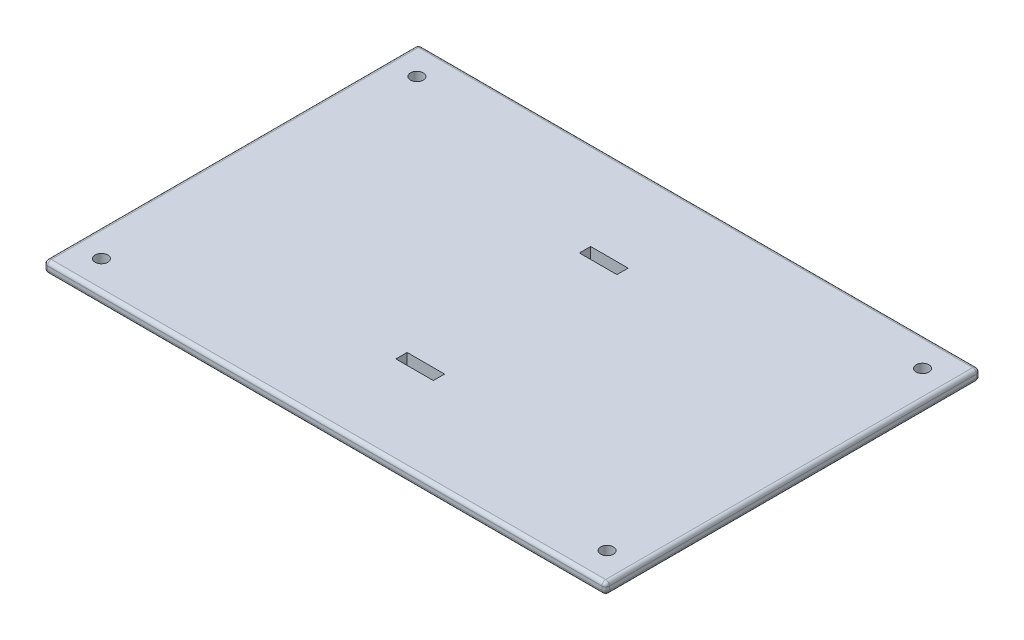
ISO-10303-21;
HEADER;
FILE_DESCRIPTION(('STEP AP214'),'2;1');
FILE_NAME('part.step','',(''),(''),'','','');
FILE_SCHEMA(('AUTOMOTIVE_DESIGN { 1 0 10303 214 1 1 1 1 }'));
ENDSEC;
DATA;
#1=APPLICATION_CONTEXT('core data for automotive mechanical design processes');
#2=APPLICATION_PROTOCOL_DEFINITION('international standard','automotive_design',2000,#1);
#3=PRODUCT_CONTEXT('',#1,'mechanical');
#4=PRODUCT('Part','Part','',(#3));
#5=PRODUCT_RELATED_PRODUCT_CATEGORY('part','',(#4));
#6=PRODUCT_DEFINITION_FORMATION('','',#4);
#7=PRODUCT_DEFINITION_CONTEXT('part definition',#1,'design');
#8=PRODUCT_DEFINITION('design','',#6,#7);
#9=PRODUCT_DEFINITION_SHAPE('','',#8);
#10=(LENGTH_UNIT() NAMED_UNIT(*) SI_UNIT(.MILLI.,.METRE.));
#11=(NAMED_UNIT(*) PLANE_ANGLE_UNIT() SI_UNIT($,.RADIAN.));
#12=(NAMED_UNIT(*) SI_UNIT($,.STERADIAN.) SOLID_ANGLE_UNIT());
#13=UNCERTAINTY_MEASURE_WITH_UNIT(LENGTH_MEASURE(1.E-05),#10,'distance_accuracy_value','');
#14=(GEOMETRIC_REPRESENTATION_CONTEXT(3) GLOBAL_UNCERTAINTY_ASSIGNED_CONTEXT((#13)) GLOBAL_UNIT_ASSIGNED_CONTEXT((#10,
#11,#12)) REPRESENTATION_CONTEXT('',''));
#15=CARTESIAN_POINT('',(0.,0.,0.));
#16=DIRECTION('',(0.,0.,1.));
#17=DIRECTION('',(1.,0.,0.));
#18=AXIS2_PLACEMENT_3D('',#15,#16,#17);
#19=CARTESIAN_POINT('',(75.,3.,50.));
#20=DIRECTION('',(-1.,0.,0.));
#21=DIRECTION('',(0.,0.,1.));
#22=AXIS2_PLACEMENT_3D('',#19,#20,#21);
#23=PLANE('',#22);
#24=DIRECTION('',(0.,-1.,0.));
#25=VECTOR('',#24,1.);
#26=CARTESIAN_POINT('',(75.,3.,49.));
#27=LINE('',#26,#25);
#28=CARTESIAN_POINT('',(75.,2.,49.));
#29=VERTEX_POINT('',#28);
#30=CARTESIAN_POINT('',(75.,1.,49.));
#31=VERTEX_POINT('',#30);
#32=EDGE_CURVE('E263',#29,#31,#27,.T.);
#33=ORIENTED_EDGE('',*,*,#32,.T.);
#34=DIRECTION('',(0.,0.,-1.));
#35=VECTOR('',#34,1.);
#36=CARTESIAN_POINT('',(75.,1.,-50.));
#37=LINE('',#36,#35);
#38=CARTESIAN_POINT('',(75.,1.,-49.));
#39=VERTEX_POINT('',#38);
#40=EDGE_CURVE('E266',#31,#39,#37,.T.);
#41=ORIENTED_EDGE('',*,*,#40,.T.);
#42=DIRECTION('',(0.,-1.,0.));
#43=VECTOR('',#42,1.);
#44=CARTESIAN_POINT('',(75.,3.,-49.));
#45=LINE('',#44,#43);
#46=CARTESIAN_POINT('',(75.,2.,-49.));
#47=VERTEX_POINT('',#46);
#48=EDGE_CURVE('E260',#39,#47,#45,.F.);
#49=ORIENTED_EDGE('',*,*,#48,.T.);
#50=DIRECTION('',(0.,0.,-1.));
#51=VECTOR('',#50,1.);
#52=CARTESIAN_POINT('',(75.,2.,50.));
#53=LINE('',#52,#51);
#54=EDGE_CURVE('E258',#47,#29,#53,.F.);
#55=ORIENTED_EDGE('',*,*,#54,.T.);
#56=EDGE_LOOP('',(#33,#41,#49,#55));
#57=FACE_BOUND('',#56,.T.);
#58=ADVANCED_FACE('F32',(#57),#23,.F.);
#59=CARTESIAN_POINT('',(-75.,3.,-50.));
#60=DIRECTION('',(0.,0.,1.));
#61=DIRECTION('',(1.,0.,0.));
#62=AXIS2_PLACEMENT_3D('',#59,#60,#61);
#63=PLANE('',#62);
#64=DIRECTION('',(0.,-1.,0.));
#65=VECTOR('',#64,1.);
#66=CARTESIAN_POINT('',(74.,3.,-50.));
#67=LINE('',#66,#65);
#68=CARTESIAN_POINT('',(74.,2.,-50.));
#69=VERTEX_POINT('',#68);
#70=CARTESIAN_POINT('',(74.,1.,-50.));
#71=VERTEX_POINT('',#70);
#72=EDGE_CURVE('E281',#69,#71,#67,.T.);
#73=ORIENTED_EDGE('',*,*,#72,.T.);
#74=DIRECTION('',(-1.,0.,0.));
#75=VECTOR('',#74,1.);
#76=CARTESIAN_POINT('',(-75.,1.,-50.));
#77=LINE('',#76,#75);
#78=CARTESIAN_POINT('',(-74.,1.,-50.));
#79=VERTEX_POINT('',#78);
#80=EDGE_CURVE('E284',#71,#79,#77,.T.);
#81=ORIENTED_EDGE('',*,*,#80,.T.);
#82=DIRECTION('',(0.,-1.,0.));
#83=VECTOR('',#82,1.);
#84=CARTESIAN_POINT('',(-74.,3.,-50.));
#85=LINE('',#84,#83);
#86=CARTESIAN_POINT('',(-74.,2.,-50.));
#87=VERTEX_POINT('',#86);
#88=EDGE_CURVE('E279',#79,#87,#85,.F.);
#89=ORIENTED_EDGE('',*,*,#88,.T.);
#90=DIRECTION('',(-1.,0.,0.));
#91=VECTOR('',#90,1.);
#92=CARTESIAN_POINT('',(-75.,2.,-50.));
#93=LINE('',#92,#91);
#94=EDGE_CURVE('E277',#87,#69,#93,.F.);
#95=ORIENTED_EDGE('',*,*,#94,.T.);
#96=EDGE_LOOP('',(#73,#81,#89,#95));
#97=FACE_BOUND('',#96,.T.);
#98=ADVANCED_FACE('F451',(#97),#63,.F.);
#99=CARTESIAN_POINT('',(-75.,3.,50.));
#100=DIRECTION('',(1.,0.,0.));
#101=DIRECTION('',(0.,0.,-1.));
#102=AXIS2_PLACEMENT_3D('',#99,#100,#101);
#103=PLANE('',#102);
#104=DIRECTION('',(0.,-1.,0.));
#105=VECTOR('',#104,1.);
#106=CARTESIAN_POINT('',(-75.,3.,-49.));
#107=LINE('',#106,#105);
#108=CARTESIAN_POINT('',(-75.,2.,-49.));
#109=VERTEX_POINT('',#108);
#110=CARTESIAN_POINT('',(-75.,1.,-49.));
#111=VERTEX_POINT('',#110);
#112=EDGE_CURVE('E290',#109,#111,#107,.T.);
#113=ORIENTED_EDGE('',*,*,#112,.T.);
#114=DIRECTION('',(0.,0.,1.));
#115=VECTOR('',#114,1.);
#116=CARTESIAN_POINT('',(-75.,1.,50.));
#117=LINE('',#116,#115);
#118=CARTESIAN_POINT('',(-75.,1.,49.));
#119=VERTEX_POINT('',#118);
#120=EDGE_CURVE('E293',#111,#119,#117,.T.);
#121=ORIENTED_EDGE('',*,*,#120,.T.);
#122=DIRECTION('',(0.,-1.,0.));
#123=VECTOR('',#122,1.);
#124=CARTESIAN_POINT('',(-75.,3.,49.));
#125=LINE('',#124,#123);
#126=CARTESIAN_POINT('',(-75.,2.,49.));
#127=VERTEX_POINT('',#126);
#128=EDGE_CURVE('E288',#119,#127,#125,.F.);
#129=ORIENTED_EDGE('',*,*,#128,.T.);
#130=DIRECTION('',(0.,0.,1.));
#131=VECTOR('',#130,1.);
#132=CARTESIAN_POINT('',(-75.,2.,50.));
#133=LINE('',#132,#131);
#134=EDGE_CURVE('E286',#127,#109,#133,.F.);
#135=ORIENTED_EDGE('',*,*,#134,.T.);
#136=EDGE_LOOP('',(#113,#121,#129,#135));
#137=FACE_BOUND('',#136,.T.);
#138=ADVANCED_FACE('F435',(#137),#103,.F.);
#139=CARTESIAN_POINT('',(-75.,3.,50.));
#140=DIRECTION('',(0.,0.,-1.));
#141=DIRECTION('',(-1.,0.,0.));
#142=AXIS2_PLACEMENT_3D('',#139,#140,#141);
#143=PLANE('',#142);
#144=DIRECTION('',(0.,-1.,0.));
#145=VECTOR('',#144,1.);
#146=CARTESIAN_POINT('',(-74.,3.,50.));
#147=LINE('',#146,#145);
#148=CARTESIAN_POINT('',(-74.,2.,50.));
#149=VERTEX_POINT('',#148);
#150=CARTESIAN_POINT('',(-74.,1.,50.));
#151=VERTEX_POINT('',#150);
#152=EDGE_CURVE('E270',#149,#151,#147,.T.);
#153=ORIENTED_EDGE('',*,*,#152,.T.);
#154=DIRECTION('',(1.,0.,0.));
#155=VECTOR('',#154,1.);
#156=CARTESIAN_POINT('',(75.,1.,50.));
#157=LINE('',#156,#155);
#158=CARTESIAN_POINT('',(74.,1.,50.));
#159=VERTEX_POINT('',#158);
#160=EDGE_CURVE('E275',#151,#159,#157,.T.);
#161=ORIENTED_EDGE('',*,*,#160,.T.);
#162=DIRECTION('',(0.,-1.,0.));
#163=VECTOR('',#162,1.);
#164=CARTESIAN_POINT('',(74.,3.,50.));
#165=LINE('',#164,#163);
#166=CARTESIAN_POINT('',(74.,2.,50.));
#167=VERTEX_POINT('',#166);
#168=EDGE_CURVE('E272',#159,#167,#165,.F.);
#169=ORIENTED_EDGE('',*,*,#168,.T.);
#170=DIRECTION('',(1.,0.,0.));
#171=VECTOR('',#170,1.);
#172=CARTESIAN_POINT('',(-75.,2.,50.));
#173=LINE('',#172,#171);
#174=EDGE_CURVE('E268',#167,#149,#173,.F.);
#175=ORIENTED_EDGE('',*,*,#174,.T.);
#176=EDGE_LOOP('',(#153,#161,#169,#175));
#177=FACE_BOUND('',#176,.T.);
#178=ADVANCED_FACE('F487',(#177),#143,.F.);
#179=CARTESIAN_POINT('',(75.,3.,-50.));
#180=DIRECTION('',(0.,-1.,0.));
#181=DIRECTION('',(0.,0.,-1.));
#182=AXIS2_PLACEMENT_3D('',#179,#180,#181);
#183=PLANE('',#182);
#184=DIRECTION('',(-1.,0.,0.));
#185=VECTOR('',#184,1.);
#186=CARTESIAN_POINT('',(-5.,3.,23.));
#187=LINE('',#186,#185);
#188=CARTESIAN_POINT('',(4.99999999999999,3.,23.));
#189=VERTEX_POINT('',#188);
#190=CARTESIAN_POINT('',(-5.,3.,23.));
#191=VERTEX_POINT('',#190);
#192=EDGE_CURVE('E198',#189,#191,#187,.T.);
#193=ORIENTED_EDGE('',*,*,#192,.F.);
#194=DIRECTION('',(0.,0.,-1.));
#195=VECTOR('',#194,1.);
#196=CARTESIAN_POINT('',(5.,3.,26.));
#197=LINE('',#196,#195);
#198=CARTESIAN_POINT('',(5.,3.,26.));
#199=VERTEX_POINT('',#198);
#200=EDGE_CURVE('E49',#199,#189,#197,.T.);
#201=ORIENTED_EDGE('',*,*,#200,.F.);
#202=DIRECTION('',(1.,0.,0.));
#203=VECTOR('',#202,1.);
#204=CARTESIAN_POINT('',(-5.,3.,26.));
#205=LINE('',#204,#203);
#206=CARTESIAN_POINT('',(-5.,3.,26.));
#207=VERTEX_POINT('',#206);
#208=EDGE_CURVE('E189',#207,#199,#205,.T.);
#209=ORIENTED_EDGE('',*,*,#208,.F.);
#210=DIRECTION('',(0.,0.,1.));
#211=VECTOR('',#210,1.);
#212=CARTESIAN_POINT('',(-5.,3.,26.));
#213=LINE('',#212,#211);
#214=EDGE_CURVE('E192',#191,#207,#213,.T.);
#215=ORIENTED_EDGE('',*,*,#214,.F.);
#216=EDGE_LOOP('',(#193,#201,#209,#215));
#217=FACE_BOUND('',#216,.T.);
#218=DIRECTION('',(-1.,0.,0.));
#219=VECTOR('',#218,1.);
#220=CARTESIAN_POINT('',(-5.00000000000001,3.,-26.));
#221=LINE('',#220,#219);
#222=CARTESIAN_POINT('',(4.99999999999999,3.,-26.));
#223=VERTEX_POINT('',#222);
#224=CARTESIAN_POINT('',(-5.00000000000001,3.,-26.));
#225=VERTEX_POINT('',#224);
#226=EDGE_CURVE('E223',#223,#225,#221,.T.);
#227=ORIENTED_EDGE('',*,*,#226,.F.);
#228=DIRECTION('',(0.,0.,-1.));
#229=VECTOR('',#228,1.);
#230=CARTESIAN_POINT('',(4.99999999999999,3.,-26.));
#231=LINE('',#230,#229);
#232=CARTESIAN_POINT('',(5.,3.,-23.));
#233=VERTEX_POINT('',#232);
#234=EDGE_CURVE('E204',#233,#223,#231,.T.);
#235=ORIENTED_EDGE('',*,*,#234,.F.);
#236=DIRECTION('',(1.,0.,0.));
#237=VECTOR('',#236,1.);
#238=CARTESIAN_POINT('',(-5.,3.,-23.));
#239=LINE('',#238,#237);
#240=CARTESIAN_POINT('',(-5.,3.,-23.));
#241=VERTEX_POINT('',#240);
#242=EDGE_CURVE('E212',#241,#233,#239,.T.);
#243=ORIENTED_EDGE('',*,*,#242,.F.);
#244=DIRECTION('',(0.,0.,1.));
#245=VECTOR('',#244,1.);
#246=CARTESIAN_POINT('',(-5.00000000000001,3.,-26.));
#247=LINE('',#246,#245);
#248=EDGE_CURVE('E226',#225,#241,#247,.T.);
#249=ORIENTED_EDGE('',*,*,#248,.F.);
#250=EDGE_LOOP('',(#227,#235,#243,#249));
#251=FACE_BOUND('',#250,.T.);
#252=CARTESIAN_POINT('',(-67.5000000000001,3.,42.113248654052));
#253=DIRECTION('',(0.,1.,0.));
#254=DIRECTION('',(0.,0.,1.));
#255=AXIS2_PLACEMENT_3D('',#252,#253,#254);
#256=CIRCLE('',#255,1.69999999999999);
#257=CARTESIAN_POINT('',(-67.5000000000001,3.,43.813248654052));
#258=VERTEX_POINT('',#257);
#259=EDGE_CURVE('E233',#258,#258,#256,.T.);
#260=ORIENTED_EDGE('',*,*,#259,.F.);
#261=EDGE_LOOP('',(#260));
#262=FACE_BOUND('',#261,.T.);
#263=CARTESIAN_POINT('',(67.4999999999999,3.,42.1132486540518));
#264=DIRECTION('',(0.,1.,0.));
#265=DIRECTION('',(0.,0.,1.));
#266=AXIS2_PLACEMENT_3D('',#263,#264,#265);
#267=CIRCLE('',#266,1.69999999999999);
#268=CARTESIAN_POINT('',(67.4999999999999,3.,43.8132486540518));
#269=VERTEX_POINT('',#268);
#270=EDGE_CURVE('E242',#269,#269,#267,.T.);
#271=ORIENTED_EDGE('',*,*,#270,.F.);
#272=EDGE_LOOP('',(#271));
#273=FACE_BOUND('',#272,.T.);
#274=CARTESIAN_POINT('',(67.5000000000003,3.,-42.1132486540519));
#275=DIRECTION('',(0.,1.,0.));
#276=DIRECTION('',(0.,0.,1.));
#277=AXIS2_PLACEMENT_3D('',#274,#275,#276);
#278=CIRCLE('',#277,1.69999999999999);
#279=CARTESIAN_POINT('',(67.5000000000003,3.,-40.4132486540519));
#280=VERTEX_POINT('',#279);
#281=EDGE_CURVE('E248',#280,#280,#278,.T.);
#282=ORIENTED_EDGE('',*,*,#281,.F.);
#283=EDGE_LOOP('',(#282));
#284=FACE_BOUND('',#283,.T.);
#285=CARTESIAN_POINT('',(-67.5000000000001,3.,-42.1132486540518));
#286=DIRECTION('',(0.,1.,0.));
#287=DIRECTION('',(0.,0.,1.));
#288=AXIS2_PLACEMENT_3D('',#285,#286,#287);
#289=CIRCLE('',#288,1.69999999999999);
#290=CARTESIAN_POINT('',(-67.5000000000001,3.,-40.4132486540518));
#291=VERTEX_POINT('',#290);
#292=EDGE_CURVE('E254',#291,#291,#289,.T.);
#293=ORIENTED_EDGE('',*,*,#292,.F.);
#294=EDGE_LOOP('',(#293));
#295=FACE_BOUND('',#294,.T.);
#296=DIRECTION('',(0.,0.,1.));
#297=VECTOR('',#296,1.);
#298=CARTESIAN_POINT('',(-74.,3.,-50.));
#299=LINE('',#298,#297);
#300=CARTESIAN_POINT('',(-74.,3.,-49.));
#301=VERTEX_POINT('',#300);
#302=CARTESIAN_POINT('',(-74.,3.,49.));
#303=VERTEX_POINT('',#302);
#304=EDGE_CURVE('E41',#301,#303,#299,.T.);
#305=ORIENTED_EDGE('',*,*,#304,.T.);
#306=DIRECTION('',(1.,0.,0.));
#307=VECTOR('',#306,1.);
#308=CARTESIAN_POINT('',(75.,3.,49.));
#309=LINE('',#308,#307);
#310=CARTESIAN_POINT('',(74.,3.,49.));
#311=VERTEX_POINT('',#310);
#312=EDGE_CURVE('E11',#303,#311,#309,.T.);
#313=ORIENTED_EDGE('',*,*,#312,.T.);
#314=DIRECTION('',(0.,0.,-1.));
#315=VECTOR('',#314,1.);
#316=CARTESIAN_POINT('',(74.,3.,-50.));
#317=LINE('',#316,#315);
#318=CARTESIAN_POINT('',(74.,3.,-49.));
#319=VERTEX_POINT('',#318);
#320=EDGE_CURVE('E304',#311,#319,#317,.T.);
#321=ORIENTED_EDGE('',*,*,#320,.T.);
#322=DIRECTION('',(-1.,0.,0.));
#323=VECTOR('',#322,1.);
#324=CARTESIAN_POINT('',(75.,3.,-49.));
#325=LINE('',#324,#323);
#326=EDGE_CURVE('E306',#319,#301,#325,.T.);
#327=ORIENTED_EDGE('',*,*,#326,.T.);
#328=EDGE_LOOP('',(#305,#313,#321,#327));
#329=FACE_BOUND('',#328,.T.);
#330=ADVANCED_FACE('F383',(#217,#251,#262,#273,#284,#295,#329),#183,.F.);
#331=CARTESIAN_POINT('',(75.,0.,-50.));
#332=DIRECTION('',(0.,-1.,0.));
#333=DIRECTION('',(0.,0.,-1.));
#334=AXIS2_PLACEMENT_3D('',#331,#332,#333);
#335=PLANE('',#334);
#336=DIRECTION('',(0.,0.,-1.));
#337=VECTOR('',#336,1.);
#338=CARTESIAN_POINT('',(5.,0.,26.));
#339=LINE('',#338,#337);
#340=CARTESIAN_POINT('',(5.,0.,26.));
#341=VERTEX_POINT('',#340);
#342=CARTESIAN_POINT('',(5.,0.,23.));
#343=VERTEX_POINT('',#342);
#344=EDGE_CURVE('E173',#341,#343,#339,.T.);
#345=ORIENTED_EDGE('',*,*,#344,.T.);
#346=DIRECTION('',(-1.,0.,0.));
#347=VECTOR('',#346,1.);
#348=CARTESIAN_POINT('',(-5.,0.,23.));
#349=LINE('',#348,#347);
#350=CARTESIAN_POINT('',(-5.,0.,23.));
#351=VERTEX_POINT('',#350);
#352=EDGE_CURVE('E182',#343,#351,#349,.T.);
#353=ORIENTED_EDGE('',*,*,#352,.T.);
#354=DIRECTION('',(0.,0.,1.));
#355=VECTOR('',#354,1.);
#356=CARTESIAN_POINT('',(-5.,0.,26.));
#357=LINE('',#356,#355);
#358=CARTESIAN_POINT('',(-5.,0.,26.));
#359=VERTEX_POINT('',#358);
#360=EDGE_CURVE('E57',#351,#359,#357,.T.);
#361=ORIENTED_EDGE('',*,*,#360,.T.);
#362=DIRECTION('',(1.,0.,0.));
#363=VECTOR('',#362,1.);
#364=CARTESIAN_POINT('',(-5.,0.,26.));
#365=LINE('',#364,#363);
#366=EDGE_CURVE('E179',#359,#341,#365,.T.);
#367=ORIENTED_EDGE('',*,*,#366,.T.);
#368=EDGE_LOOP('',(#345,#353,#361,#367));
#369=FACE_BOUND('',#368,.T.);
#370=DIRECTION('',(0.,0.,-1.));
#371=VECTOR('',#370,1.);
#372=CARTESIAN_POINT('',(4.99999999999999,0.,-26.));
#373=LINE('',#372,#371);
#374=CARTESIAN_POINT('',(5.,0.,-23.));
#375=VERTEX_POINT('',#374);
#376=CARTESIAN_POINT('',(4.99999999999999,0.,-26.));
#377=VERTEX_POINT('',#376);
#378=EDGE_CURVE('E208',#375,#377,#373,.T.);
#379=ORIENTED_EDGE('',*,*,#378,.T.);
#380=DIRECTION('',(-1.,0.,0.));
#381=VECTOR('',#380,1.);
#382=CARTESIAN_POINT('',(-5.00000000000001,0.,-26.));
#383=LINE('',#382,#381);
#384=CARTESIAN_POINT('',(-5.,0.,-26.));
#385=VERTEX_POINT('',#384);
#386=EDGE_CURVE('E211',#377,#385,#383,.T.);
#387=ORIENTED_EDGE('',*,*,#386,.T.);
#388=DIRECTION('',(0.,0.,1.));
#389=VECTOR('',#388,1.);
#390=CARTESIAN_POINT('',(-5.00000000000001,0.,-26.));
#391=LINE('',#390,#389);
#392=CARTESIAN_POINT('',(-5.,0.,-23.));
#393=VERTEX_POINT('',#392);
#394=EDGE_CURVE('E215',#385,#393,#391,.T.);
#395=ORIENTED_EDGE('',*,*,#394,.T.);
#396=DIRECTION('',(1.,0.,0.));
#397=VECTOR('',#396,1.);
#398=CARTESIAN_POINT('',(-5.,0.,-23.));
#399=LINE('',#398,#397);
#400=EDGE_CURVE('E218',#393,#375,#399,.T.);
#401=ORIENTED_EDGE('',*,*,#400,.T.);
#402=EDGE_LOOP('',(#379,#387,#395,#401));
#403=FACE_BOUND('',#402,.T.);
#404=CARTESIAN_POINT('',(-67.5000000000001,0.,42.113248654052));
#405=DIRECTION('',(0.,-1.,0.));
#406=DIRECTION('',(0.,0.,-1.));
#407=AXIS2_PLACEMENT_3D('',#404,#405,#406);
#408=CIRCLE('',#407,1.69999999999999);
#409=CARTESIAN_POINT('',(-67.5000000000001,0.,40.413248654052));
#410=VERTEX_POINT('',#409);
#411=EDGE_CURVE('E36',#410,#410,#408,.T.);
#412=ORIENTED_EDGE('',*,*,#411,.F.);
#413=EDGE_LOOP('',(#412));
#414=FACE_BOUND('',#413,.T.);
#415=CARTESIAN_POINT('',(67.4999999999999,0.,42.1132486540518));
#416=DIRECTION('',(0.,-1.,0.));
#417=DIRECTION('',(0.,0.,-1.));
#418=AXIS2_PLACEMENT_3D('',#415,#416,#417);
#419=CIRCLE('',#418,1.69999999999999);
#420=CARTESIAN_POINT('',(67.4999999999999,0.,40.4132486540518));
#421=VERTEX_POINT('',#420);
#422=EDGE_CURVE('E245',#421,#421,#419,.T.);
#423=ORIENTED_EDGE('',*,*,#422,.F.);
#424=EDGE_LOOP('',(#423));
#425=FACE_BOUND('',#424,.T.);
#426=CARTESIAN_POINT('',(67.5000000000003,0.,-42.1132486540519));
#427=DIRECTION('',(0.,-1.,0.));
#428=DIRECTION('',(0.,0.,-1.));
#429=AXIS2_PLACEMENT_3D('',#426,#427,#428);
#430=CIRCLE('',#429,1.69999999999999);
#431=CARTESIAN_POINT('',(67.5000000000003,0.,-43.8132486540519));
#432=VERTEX_POINT('',#431);
#433=EDGE_CURVE('E251',#432,#432,#430,.T.);
#434=ORIENTED_EDGE('',*,*,#433,.F.);
#435=EDGE_LOOP('',(#434));
#436=FACE_BOUND('',#435,.T.);
#437=CARTESIAN_POINT('',(-67.5000000000001,0.,-42.1132486540518));
#438=DIRECTION('',(0.,-1.,0.));
#439=DIRECTION('',(0.,0.,-1.));
#440=AXIS2_PLACEMENT_3D('',#437,#438,#439);
#441=CIRCLE('',#440,1.69999999999999);
#442=CARTESIAN_POINT('',(-67.5000000000001,0.,-43.8132486540518));
#443=VERTEX_POINT('',#442);
#444=EDGE_CURVE('E257',#443,#443,#441,.T.);
#445=ORIENTED_EDGE('',*,*,#444,.F.);
#446=EDGE_LOOP('',(#445));
#447=FACE_BOUND('',#446,.T.);
#448=DIRECTION('',(0.,0.,1.));
#449=VECTOR('',#448,1.);
#450=CARTESIAN_POINT('',(-74.,0.,-50.));
#451=LINE('',#450,#449);
#452=CARTESIAN_POINT('',(-74.,0.,49.));
#453=VERTEX_POINT('',#452);
#454=CARTESIAN_POINT('',(-74.,0.,-49.));
#455=VERTEX_POINT('',#454);
#456=EDGE_CURVE('E299',#453,#455,#451,.F.);
#457=ORIENTED_EDGE('',*,*,#456,.T.);
#458=DIRECTION('',(-1.,0.,0.));
#459=VECTOR('',#458,1.);
#460=CARTESIAN_POINT('',(75.,0.,-49.));
#461=LINE('',#460,#459);
#462=CARTESIAN_POINT('',(74.,0.,-49.));
#463=VERTEX_POINT('',#462);
#464=EDGE_CURVE('E301',#455,#463,#461,.F.);
#465=ORIENTED_EDGE('',*,*,#464,.T.);
#466=DIRECTION('',(0.,0.,-1.));
#467=VECTOR('',#466,1.);
#468=CARTESIAN_POINT('',(74.,0.,50.));
#469=LINE('',#468,#467);
#470=CARTESIAN_POINT('',(74.,0.,49.));
#471=VERTEX_POINT('',#470);
#472=EDGE_CURVE('E295',#463,#471,#469,.F.);
#473=ORIENTED_EDGE('',*,*,#472,.T.);
#474=DIRECTION('',(1.,0.,0.));
#475=VECTOR('',#474,1.);
#476=CARTESIAN_POINT('',(-75.,0.,49.));
#477=LINE('',#476,#475);
#478=EDGE_CURVE('E297',#471,#453,#477,.F.);
#479=ORIENTED_EDGE('',*,*,#478,.T.);
#480=EDGE_LOOP('',(#457,#465,#473,#479));
#481=FACE_BOUND('',#480,.T.);
#482=ADVANCED_FACE('F186',(#369,#403,#414,#425,#436,#447,#481),#335,.T.);
#483=CARTESIAN_POINT('',(-74.,3.,-49.));
#484=DIRECTION('',(0.,-1.,0.));
#485=DIRECTION('',(0.,0.,-1.));
#486=AXIS2_PLACEMENT_3D('',#483,#484,#485);
#487=CYLINDRICAL_SURFACE('',#486,1.);
#488=CARTESIAN_POINT('',(-74.,2.,-49.));
#489=DIRECTION('',(0.,1.,0.));
#490=DIRECTION('',(0.,0.,1.));
#491=AXIS2_PLACEMENT_3D('',#488,#489,#490);
#492=CIRCLE('',#491,1.);
#493=EDGE_CURVE('E261',#87,#109,#492,.T.);
#494=ORIENTED_EDGE('',*,*,#493,.F.);
#495=ORIENTED_EDGE('',*,*,#88,.F.);
#496=CARTESIAN_POINT('',(-74.,1.,-49.));
#497=DIRECTION('',(0.,-1.,0.));
#498=DIRECTION('',(0.,0.,-1.));
#499=AXIS2_PLACEMENT_3D('',#496,#497,#498);
#500=CIRCLE('',#499,1.);
#501=EDGE_CURVE('E371',#111,#79,#500,.T.);
#502=ORIENTED_EDGE('',*,*,#501,.F.);
#503=ORIENTED_EDGE('',*,*,#112,.F.);
#504=EDGE_LOOP('',(#494,#495,#502,#503));
#505=FACE_BOUND('',#504,.T.);
#506=ADVANCED_FACE('F34',(#505),#487,.T.);
#507=CARTESIAN_POINT('',(-74.,2.,-49.));
#508=DIRECTION('',(0.,0.,1.));
#509=DIRECTION('',(1.,0.,0.));
#510=AXIS2_PLACEMENT_3D('',#507,#508,#509);
#511=SPHERICAL_SURFACE('',#510,1.);
#512=CARTESIAN_POINT('',(-74.,2.,-49.));
#513=DIRECTION('',(-1.,0.,0.));
#514=DIRECTION('',(0.,0.,1.));
#515=AXIS2_PLACEMENT_3D('',#512,#513,#514);
#516=CIRCLE('',#515,1.);
#517=EDGE_CURVE('E365',#87,#301,#516,.F.);
#518=ORIENTED_EDGE('',*,*,#517,.F.);
#519=ORIENTED_EDGE('',*,*,#493,.T.);
#520=CARTESIAN_POINT('',(-74.,2.,-49.));
#521=DIRECTION('',(0.,0.,-1.));
#522=DIRECTION('',(-1.,0.,0.));
#523=AXIS2_PLACEMENT_3D('',#520,#521,#522);
#524=CIRCLE('',#523,1.);
#525=EDGE_CURVE('E368',#301,#109,#524,.F.);
#526=ORIENTED_EDGE('',*,*,#525,.F.);
#527=EDGE_LOOP('',(#518,#519,#526));
#528=FACE_BOUND('',#527,.T.);
#529=ADVANCED_FACE('F445',(#528),#511,.T.);
#530=CARTESIAN_POINT('',(-74.,1.,-49.));
#531=DIRECTION('',(0.,0.,1.));
#532=DIRECTION('',(1.,0.,0.));
#533=AXIS2_PLACEMENT_3D('',#530,#531,#532);
#534=SPHERICAL_SURFACE('',#533,1.);
#535=CARTESIAN_POINT('',(-74.,1.,-49.));
#536=DIRECTION('',(0.,0.,-1.));
#537=DIRECTION('',(-1.,0.,0.));
#538=AXIS2_PLACEMENT_3D('',#535,#536,#537);
#539=CIRCLE('',#538,1.);
#540=EDGE_CURVE('E359',#111,#455,#539,.F.);
#541=ORIENTED_EDGE('',*,*,#540,.F.);
#542=ORIENTED_EDGE('',*,*,#501,.T.);
#543=CARTESIAN_POINT('',(-74.,1.,-49.));
#544=DIRECTION('',(-1.,0.,0.));
#545=DIRECTION('',(0.,0.,1.));
#546=AXIS2_PLACEMENT_3D('',#543,#544,#545);
#547=CIRCLE('',#546,1.);
#548=EDGE_CURVE('E362',#455,#79,#547,.F.);
#549=ORIENTED_EDGE('',*,*,#548,.F.);
#550=EDGE_LOOP('',(#541,#542,#549));
#551=FACE_BOUND('',#550,.T.);
#552=ADVANCED_FACE('F395',(#551),#534,.T.);
#553=CARTESIAN_POINT('',(-74.,2.,-50.));
#554=DIRECTION('',(0.,0.,1.));
#555=DIRECTION('',(1.,0.,0.));
#556=AXIS2_PLACEMENT_3D('',#553,#554,#555);
#557=CYLINDRICAL_SURFACE('',#556,1.);
#558=ORIENTED_EDGE('',*,*,#525,.T.);
#559=ORIENTED_EDGE('',*,*,#134,.F.);
#560=CARTESIAN_POINT('',(-74.,2.,49.));
#561=DIRECTION('',(0.,0.,1.));
#562=DIRECTION('',(1.,0.,0.));
#563=AXIS2_PLACEMENT_3D('',#560,#561,#562);
#564=CIRCLE('',#563,1.);
#565=EDGE_CURVE('E353',#303,#127,#564,.T.);
#566=ORIENTED_EDGE('',*,*,#565,.F.);
#567=ORIENTED_EDGE('',*,*,#304,.F.);
#568=EDGE_LOOP('',(#558,#559,#566,#567));
#569=FACE_BOUND('',#568,.T.);
#570=ADVANCED_FACE('F439',(#569),#557,.T.);
#571=CARTESIAN_POINT('',(75.,2.,-49.));
#572=DIRECTION('',(-1.,0.,0.));
#573=DIRECTION('',(0.,0.,1.));
#574=AXIS2_PLACEMENT_3D('',#571,#572,#573);
#575=CYLINDRICAL_SURFACE('',#574,1.);
#576=ORIENTED_EDGE('',*,*,#517,.T.);
#577=ORIENTED_EDGE('',*,*,#326,.F.);
#578=CARTESIAN_POINT('',(74.,2.,-49.));
#579=DIRECTION('',(1.,0.,0.));
#580=DIRECTION('',(0.,0.,-1.));
#581=AXIS2_PLACEMENT_3D('',#578,#579,#580);
#582=CIRCLE('',#581,1.);
#583=EDGE_CURVE('E350',#69,#319,#582,.T.);
#584=ORIENTED_EDGE('',*,*,#583,.F.);
#585=ORIENTED_EDGE('',*,*,#94,.F.);
#586=EDGE_LOOP('',(#576,#577,#584,#585));
#587=FACE_BOUND('',#586,.T.);
#588=ADVANCED_FACE('F453',(#587),#575,.T.);
#589=CARTESIAN_POINT('',(74.,3.,-49.));
#590=DIRECTION('',(0.,-1.,0.));
#591=DIRECTION('',(0.,0.,-1.));
#592=AXIS2_PLACEMENT_3D('',#589,#590,#591);
#593=CYLINDRICAL_SURFACE('',#592,1.);
#594=CARTESIAN_POINT('',(74.,1.,-49.));
#595=DIRECTION('',(0.,-1.,0.));
#596=DIRECTION('',(0.,0.,-1.));
#597=AXIS2_PLACEMENT_3D('',#594,#595,#596);
#598=CIRCLE('',#597,1.);
#599=EDGE_CURVE('E344',#71,#39,#598,.T.);
#600=ORIENTED_EDGE('',*,*,#599,.F.);
#601=ORIENTED_EDGE('',*,*,#72,.F.);
#602=CARTESIAN_POINT('',(74.,2.,-49.));
#603=DIRECTION('',(0.,1.,0.));
#604=DIRECTION('',(0.,0.,1.));
#605=AXIS2_PLACEMENT_3D('',#602,#603,#604);
#606=CIRCLE('',#605,1.);
#607=EDGE_CURVE('E347',#47,#69,#606,.T.);
#608=ORIENTED_EDGE('',*,*,#607,.F.);
#609=ORIENTED_EDGE('',*,*,#48,.F.);
#610=EDGE_LOOP('',(#600,#601,#608,#609));
#611=FACE_BOUND('',#610,.T.);
#612=ADVANCED_FACE('F407',(#611),#593,.T.);
#613=CARTESIAN_POINT('',(-75.,1.,-49.));
#614=DIRECTION('',(1.,0.,0.));
#615=DIRECTION('',(0.,0.,-1.));
#616=AXIS2_PLACEMENT_3D('',#613,#614,#615);
#617=CYLINDRICAL_SURFACE('',#616,1.);
#618=ORIENTED_EDGE('',*,*,#548,.T.);
#619=ORIENTED_EDGE('',*,*,#80,.F.);
#620=CARTESIAN_POINT('',(74.,1.,-49.));
#621=DIRECTION('',(1.,0.,0.));
#622=DIRECTION('',(0.,0.,-1.));
#623=AXIS2_PLACEMENT_3D('',#620,#621,#622);
#624=CIRCLE('',#623,1.);
#625=EDGE_CURVE('E342',#463,#71,#624,.T.);
#626=ORIENTED_EDGE('',*,*,#625,.F.);
#627=ORIENTED_EDGE('',*,*,#464,.F.);
#628=EDGE_LOOP('',(#618,#619,#626,#627));
#629=FACE_BOUND('',#628,.T.);
#630=ADVANCED_FACE('F399',(#629),#617,.T.);
#631=CARTESIAN_POINT('',(-74.,1.,50.));
#632=DIRECTION('',(0.,0.,-1.));
#633=DIRECTION('',(-1.,0.,0.));
#634=AXIS2_PLACEMENT_3D('',#631,#632,#633);
#635=CYLINDRICAL_SURFACE('',#634,1.);
#636=ORIENTED_EDGE('',*,*,#540,.T.);
#637=ORIENTED_EDGE('',*,*,#456,.F.);
#638=CARTESIAN_POINT('',(-74.,1.,49.));
#639=DIRECTION('',(0.,0.,1.));
#640=DIRECTION('',(1.,0.,0.));
#641=AXIS2_PLACEMENT_3D('',#638,#639,#640);
#642=CIRCLE('',#641,1.);
#643=EDGE_CURVE('E339',#119,#453,#642,.T.);
#644=ORIENTED_EDGE('',*,*,#643,.F.);
#645=ORIENTED_EDGE('',*,*,#120,.F.);
#646=EDGE_LOOP('',(#636,#637,#644,#645));
#647=FACE_BOUND('',#646,.T.);
#648=ADVANCED_FACE('F392',(#647),#635,.T.);
#649=CARTESIAN_POINT('',(-74.,3.,49.));
#650=DIRECTION('',(0.,-1.,0.));
#651=DIRECTION('',(0.,0.,-1.));
#652=AXIS2_PLACEMENT_3D('',#649,#650,#651);
#653=CYLINDRICAL_SURFACE('',#652,1.);
#654=CARTESIAN_POINT('',(-74.,2.,49.));
#655=DIRECTION('',(0.,1.,0.));
#656=DIRECTION('',(0.,0.,1.));
#657=AXIS2_PLACEMENT_3D('',#654,#655,#656);
#658=CIRCLE('',#657,1.);
#659=EDGE_CURVE('E356',#127,#149,#658,.T.);
#660=ORIENTED_EDGE('',*,*,#659,.F.);
#661=ORIENTED_EDGE('',*,*,#128,.F.);
#662=CARTESIAN_POINT('',(-74.,1.,49.));
#663=DIRECTION('',(0.,-1.,0.));
#664=DIRECTION('',(0.,0.,-1.));
#665=AXIS2_PLACEMENT_3D('',#662,#663,#664);
#666=CIRCLE('',#665,1.);
#667=EDGE_CURVE('E336',#151,#119,#666,.T.);
#668=ORIENTED_EDGE('',*,*,#667,.F.);
#669=ORIENTED_EDGE('',*,*,#152,.F.);
#670=EDGE_LOOP('',(#660,#661,#668,#669));
#671=FACE_BOUND('',#670,.T.);
#672=ADVANCED_FACE('F432',(#671),#653,.T.);
#673=CARTESIAN_POINT('',(-74.,2.,49.));
#674=DIRECTION('',(0.,0.,1.));
#675=DIRECTION('',(1.,0.,0.));
#676=AXIS2_PLACEMENT_3D('',#673,#674,#675);
#677=SPHERICAL_SURFACE('',#676,1.);
#678=ORIENTED_EDGE('',*,*,#565,.T.);
#679=ORIENTED_EDGE('',*,*,#659,.T.);
#680=CARTESIAN_POINT('',(-74.,2.,49.));
#681=DIRECTION('',(-1.,0.,0.));
#682=DIRECTION('',(0.,0.,1.));
#683=AXIS2_PLACEMENT_3D('',#680,#681,#682);
#684=CIRCLE('',#683,1.);
#685=EDGE_CURVE('E333',#303,#149,#684,.F.);
#686=ORIENTED_EDGE('',*,*,#685,.F.);
#687=EDGE_LOOP('',(#678,#679,#686));
#688=FACE_BOUND('',#687,.T.);
#689=ADVANCED_FACE('F555',(#688),#677,.T.);
#690=CARTESIAN_POINT('',(74.,2.,-49.));
#691=DIRECTION('',(0.,0.,1.));
#692=DIRECTION('',(1.,0.,0.));
#693=AXIS2_PLACEMENT_3D('',#690,#691,#692);
#694=SPHERICAL_SURFACE('',#693,1.);
#695=ORIENTED_EDGE('',*,*,#607,.T.);
#696=ORIENTED_EDGE('',*,*,#583,.T.);
#697=CARTESIAN_POINT('',(74.,2.,-49.));
#698=DIRECTION('',(0.,0.,-1.));
#699=DIRECTION('',(-1.,0.,0.));
#700=AXIS2_PLACEMENT_3D('',#697,#698,#699);
#701=CIRCLE('',#700,1.);
#702=EDGE_CURVE('E330',#47,#319,#701,.F.);
#703=ORIENTED_EDGE('',*,*,#702,.F.);
#704=EDGE_LOOP('',(#695,#696,#703));
#705=FACE_BOUND('',#704,.T.);
#706=ADVANCED_FACE('F456',(#705),#694,.T.);
#707=CARTESIAN_POINT('',(74.,1.,-49.));
#708=DIRECTION('',(0.,0.,1.));
#709=DIRECTION('',(1.,0.,0.));
#710=AXIS2_PLACEMENT_3D('',#707,#708,#709);
#711=SPHERICAL_SURFACE('',#710,1.);
#712=ORIENTED_EDGE('',*,*,#625,.T.);
#713=ORIENTED_EDGE('',*,*,#599,.T.);
#714=CARTESIAN_POINT('',(74.,1.,-49.));
#715=DIRECTION('',(0.,0.,-1.));
#716=DIRECTION('',(-1.,0.,0.));
#717=AXIS2_PLACEMENT_3D('',#714,#715,#716);
#718=CIRCLE('',#717,1.);
#719=EDGE_CURVE('E327',#463,#39,#718,.F.);
#720=ORIENTED_EDGE('',*,*,#719,.F.);
#721=EDGE_LOOP('',(#712,#713,#720));
#722=FACE_BOUND('',#721,.T.);
#723=ADVANCED_FACE('F403',(#722),#711,.T.);
#724=CARTESIAN_POINT('',(-74.,1.,49.));
#725=DIRECTION('',(0.,0.,1.));
#726=DIRECTION('',(1.,0.,0.));
#727=AXIS2_PLACEMENT_3D('',#724,#725,#726);
#728=SPHERICAL_SURFACE('',#727,1.);
#729=ORIENTED_EDGE('',*,*,#667,.T.);
#730=ORIENTED_EDGE('',*,*,#643,.T.);
#731=CARTESIAN_POINT('',(-74.,1.,49.));
#732=DIRECTION('',(-1.,0.,0.));
#733=DIRECTION('',(0.,0.,1.));
#734=AXIS2_PLACEMENT_3D('',#731,#732,#733);
#735=CIRCLE('',#734,1.);
#736=EDGE_CURVE('E324',#151,#453,#735,.F.);
#737=ORIENTED_EDGE('',*,*,#736,.F.);
#738=EDGE_LOOP('',(#729,#730,#737));
#739=FACE_BOUND('',#738,.T.);
#740=ADVANCED_FACE('F426',(#739),#728,.T.);
#741=CARTESIAN_POINT('',(75.,2.,49.));
#742=DIRECTION('',(1.,0.,0.));
#743=DIRECTION('',(0.,0.,-1.));
#744=AXIS2_PLACEMENT_3D('',#741,#742,#743);
#745=CYLINDRICAL_SURFACE('',#744,1.);
#746=ORIENTED_EDGE('',*,*,#685,.T.);
#747=ORIENTED_EDGE('',*,*,#174,.F.);
#748=CARTESIAN_POINT('',(74.,2.,49.));
#749=DIRECTION('',(1.,0.,0.));
#750=DIRECTION('',(0.,0.,-1.));
#751=AXIS2_PLACEMENT_3D('',#748,#749,#750);
#752=CIRCLE('',#751,1.);
#753=EDGE_CURVE('E321',#311,#167,#752,.T.);
#754=ORIENTED_EDGE('',*,*,#753,.F.);
#755=ORIENTED_EDGE('',*,*,#312,.F.);
#756=EDGE_LOOP('',(#746,#747,#754,#755));
#757=FACE_BOUND('',#756,.T.);
#758=ADVANCED_FACE('F553',(#757),#745,.T.);
#759=CARTESIAN_POINT('',(74.,2.,-50.));
#760=DIRECTION('',(0.,0.,-1.));
#761=DIRECTION('',(-1.,0.,0.));
#762=AXIS2_PLACEMENT_3D('',#759,#760,#761);
#763=CYLINDRICAL_SURFACE('',#762,1.);
#764=ORIENTED_EDGE('',*,*,#702,.T.);
#765=ORIENTED_EDGE('',*,*,#320,.F.);
#766=CARTESIAN_POINT('',(74.,2.,49.));
#767=DIRECTION('',(0.,0.,1.));
#768=DIRECTION('',(1.,0.,0.));
#769=AXIS2_PLACEMENT_3D('',#766,#767,#768);
#770=CIRCLE('',#769,1.);
#771=EDGE_CURVE('E319',#29,#311,#770,.T.);
#772=ORIENTED_EDGE('',*,*,#771,.F.);
#773=ORIENTED_EDGE('',*,*,#54,.F.);
#774=EDGE_LOOP('',(#764,#765,#772,#773));
#775=FACE_BOUND('',#774,.T.);
#776=ADVANCED_FACE('F459',(#775),#763,.T.);
#777=CARTESIAN_POINT('',(74.,1.,50.));
#778=DIRECTION('',(0.,0.,1.));
#779=DIRECTION('',(1.,0.,0.));
#780=AXIS2_PLACEMENT_3D('',#777,#778,#779);
#781=CYLINDRICAL_SURFACE('',#780,1.);
#782=ORIENTED_EDGE('',*,*,#719,.T.);
#783=ORIENTED_EDGE('',*,*,#40,.F.);
#784=CARTESIAN_POINT('',(74.,1.,49.));
#785=DIRECTION('',(0.,0.,1.));
#786=DIRECTION('',(1.,0.,0.));
#787=AXIS2_PLACEMENT_3D('',#784,#785,#786);
#788=CIRCLE('',#787,1.);
#789=EDGE_CURVE('E316',#471,#31,#788,.T.);
#790=ORIENTED_EDGE('',*,*,#789,.F.);
#791=ORIENTED_EDGE('',*,*,#472,.F.);
#792=EDGE_LOOP('',(#782,#783,#790,#791));
#793=FACE_BOUND('',#792,.T.);
#794=ADVANCED_FACE('F418',(#793),#781,.T.);
#795=CARTESIAN_POINT('',(-75.,1.,49.));
#796=DIRECTION('',(-1.,0.,0.));
#797=DIRECTION('',(0.,0.,1.));
#798=AXIS2_PLACEMENT_3D('',#795,#796,#797);
#799=CYLINDRICAL_SURFACE('',#798,1.);
#800=ORIENTED_EDGE('',*,*,#736,.T.);
#801=ORIENTED_EDGE('',*,*,#478,.F.);
#802=CARTESIAN_POINT('',(74.,1.,49.));
#803=DIRECTION('',(1.,0.,0.));
#804=DIRECTION('',(0.,0.,-1.));
#805=AXIS2_PLACEMENT_3D('',#802,#803,#804);
#806=CIRCLE('',#805,1.);
#807=EDGE_CURVE('E313',#159,#471,#806,.T.);
#808=ORIENTED_EDGE('',*,*,#807,.F.);
#809=ORIENTED_EDGE('',*,*,#160,.F.);
#810=EDGE_LOOP('',(#800,#801,#808,#809));
#811=FACE_BOUND('',#810,.T.);
#812=ADVANCED_FACE('F421',(#811),#799,.T.);
#813=CARTESIAN_POINT('',(74.,2.,49.));
#814=DIRECTION('',(0.,0.,1.));
#815=DIRECTION('',(1.,0.,0.));
#816=AXIS2_PLACEMENT_3D('',#813,#814,#815);
#817=SPHERICAL_SURFACE('',#816,1.);
#818=ORIENTED_EDGE('',*,*,#771,.T.);
#819=ORIENTED_EDGE('',*,*,#753,.T.);
#820=CARTESIAN_POINT('',(74.,2.,49.));
#821=DIRECTION('',(0.,1.,0.));
#822=DIRECTION('',(0.,0.,1.));
#823=AXIS2_PLACEMENT_3D('',#820,#821,#822);
#824=CIRCLE('',#823,1.);
#825=EDGE_CURVE('E311',#29,#167,#824,.F.);
#826=ORIENTED_EDGE('',*,*,#825,.F.);
#827=EDGE_LOOP('',(#818,#819,#826));
#828=FACE_BOUND('',#827,.T.);
#829=ADVANCED_FACE('F463',(#828),#817,.T.);
#830=CARTESIAN_POINT('',(74.,1.,49.));
#831=DIRECTION('',(0.,0.,1.));
#832=DIRECTION('',(1.,0.,0.));
#833=AXIS2_PLACEMENT_3D('',#830,#831,#832);
#834=SPHERICAL_SURFACE('',#833,1.);
#835=ORIENTED_EDGE('',*,*,#807,.T.);
#836=ORIENTED_EDGE('',*,*,#789,.T.);
#837=CARTESIAN_POINT('',(74.,1.,49.));
#838=DIRECTION('',(0.,-1.,0.));
#839=DIRECTION('',(0.,0.,-1.));
#840=AXIS2_PLACEMENT_3D('',#837,#838,#839);
#841=CIRCLE('',#840,1.);
#842=EDGE_CURVE('E309',#159,#31,#841,.F.);
#843=ORIENTED_EDGE('',*,*,#842,.F.);
#844=EDGE_LOOP('',(#835,#836,#843));
#845=FACE_BOUND('',#844,.T.);
#846=ADVANCED_FACE('F469',(#845),#834,.T.);
#847=CARTESIAN_POINT('',(74.,3.,49.));
#848=DIRECTION('',(0.,-1.,0.));
#849=DIRECTION('',(0.,0.,-1.));
#850=AXIS2_PLACEMENT_3D('',#847,#848,#849);
#851=CYLINDRICAL_SURFACE('',#850,1.);
#852=ORIENTED_EDGE('',*,*,#825,.T.);
#853=ORIENTED_EDGE('',*,*,#168,.F.);
#854=ORIENTED_EDGE('',*,*,#842,.T.);
#855=ORIENTED_EDGE('',*,*,#32,.F.);
#856=EDGE_LOOP('',(#852,#853,#854,#855));
#857=FACE_BOUND('',#856,.T.);
#858=ADVANCED_FACE('F466',(#857),#851,.T.);
#859=CARTESIAN_POINT('',(-67.5000000000001,3.,-42.1132486540518));
#860=DIRECTION('',(0.,1.,0.));
#861=DIRECTION('',(0.,0.,1.));
#862=AXIS2_PLACEMENT_3D('',#859,#860,#861);
#863=CYLINDRICAL_SURFACE('',#862,1.69999999999999);
#864=ORIENTED_EDGE('',*,*,#444,.T.);
#865=EDGE_LOOP('',(#864));
#866=FACE_BOUND('',#865,.T.);
#867=ORIENTED_EDGE('',*,*,#292,.T.);
#868=EDGE_LOOP('',(#867));
#869=FACE_BOUND('',#868,.T.);
#870=ADVANCED_FACE('F378',(#866,#869),#863,.F.);
#871=CARTESIAN_POINT('',(67.5000000000003,3.,-42.1132486540519));
#872=DIRECTION('',(0.,1.,0.));
#873=DIRECTION('',(0.,0.,1.));
#874=AXIS2_PLACEMENT_3D('',#871,#872,#873);
#875=CYLINDRICAL_SURFACE('',#874,1.69999999999999);
#876=ORIENTED_EDGE('',*,*,#433,.T.);
#877=EDGE_LOOP('',(#876));
#878=FACE_BOUND('',#877,.T.);
#879=ORIENTED_EDGE('',*,*,#281,.T.);
#880=EDGE_LOOP('',(#879));
#881=FACE_BOUND('',#880,.T.);
#882=ADVANCED_FACE('F496',(#878,#881),#875,.F.);
#883=CARTESIAN_POINT('',(67.4999999999999,3.,42.1132486540518));
#884=DIRECTION('',(0.,1.,0.));
#885=DIRECTION('',(0.,0.,1.));
#886=AXIS2_PLACEMENT_3D('',#883,#884,#885);
#887=CYLINDRICAL_SURFACE('',#886,1.69999999999999);
#888=ORIENTED_EDGE('',*,*,#422,.T.);
#889=EDGE_LOOP('',(#888));
#890=FACE_BOUND('',#889,.T.);
#891=ORIENTED_EDGE('',*,*,#270,.T.);
#892=EDGE_LOOP('',(#891));
#893=FACE_BOUND('',#892,.T.);
#894=ADVANCED_FACE('F499',(#890,#893),#887,.F.);
#895=CARTESIAN_POINT('',(-67.5000000000001,3.,42.113248654052));
#896=DIRECTION('',(0.,1.,0.));
#897=DIRECTION('',(0.,0.,1.));
#898=AXIS2_PLACEMENT_3D('',#895,#896,#897);
#899=CYLINDRICAL_SURFACE('',#898,1.69999999999999);
#900=ORIENTED_EDGE('',*,*,#411,.T.);
#901=EDGE_LOOP('',(#900));
#902=FACE_BOUND('',#901,.T.);
#903=ORIENTED_EDGE('',*,*,#259,.T.);
#904=EDGE_LOOP('',(#903));
#905=FACE_BOUND('',#904,.T.);
#906=ADVANCED_FACE('F503',(#902,#905),#899,.F.);
#907=CARTESIAN_POINT('',(4.99999999999999,0.,-26.));
#908=DIRECTION('',(1.,0.,0.));
#909=DIRECTION('',(0.,0.,-1.));
#910=AXIS2_PLACEMENT_3D('',#907,#908,#909);
#911=PLANE('',#910);
#912=ORIENTED_EDGE('',*,*,#234,.T.);
#913=DIRECTION('',(0.,1.,0.));
#914=VECTOR('',#913,1.);
#915=CARTESIAN_POINT('',(4.99999999999999,0.,-26.));
#916=LINE('',#915,#914);
#917=EDGE_CURVE('E221',#377,#223,#916,.T.);
#918=ORIENTED_EDGE('',*,*,#917,.F.);
#919=ORIENTED_EDGE('',*,*,#378,.F.);
#920=DIRECTION('',(0.,1.,0.));
#921=VECTOR('',#920,1.);
#922=CARTESIAN_POINT('',(5.,0.,-23.));
#923=LINE('',#922,#921);
#924=EDGE_CURVE('E231',#375,#233,#923,.T.);
#925=ORIENTED_EDGE('',*,*,#924,.T.);
#926=EDGE_LOOP('',(#912,#918,#919,#925));
#927=FACE_BOUND('',#926,.T.);
#928=ADVANCED_FACE('F507',(#927),#911,.F.);
#929=CARTESIAN_POINT('',(-5.,0.,-23.));
#930=DIRECTION('',(0.,0.,1.));
#931=DIRECTION('',(1.,0.,0.));
#932=AXIS2_PLACEMENT_3D('',#929,#930,#931);
#933=PLANE('',#932);
#934=ORIENTED_EDGE('',*,*,#242,.T.);
#935=ORIENTED_EDGE('',*,*,#924,.F.);
#936=ORIENTED_EDGE('',*,*,#400,.F.);
#937=DIRECTION('',(0.,1.,0.));
#938=VECTOR('',#937,1.);
#939=CARTESIAN_POINT('',(-5.,0.,-23.));
#940=LINE('',#939,#938);
#941=EDGE_CURVE('E234',#393,#241,#940,.T.);
#942=ORIENTED_EDGE('',*,*,#941,.T.);
#943=EDGE_LOOP('',(#934,#935,#936,#942));
#944=FACE_BOUND('',#943,.T.);
#945=ADVANCED_FACE('F511',(#944),#933,.F.);
#946=CARTESIAN_POINT('',(-5.00000000000001,0.,-26.));
#947=DIRECTION('',(-1.,0.,0.));
#948=DIRECTION('',(0.,0.,1.));
#949=AXIS2_PLACEMENT_3D('',#946,#947,#948);
#950=PLANE('',#949);
#951=ORIENTED_EDGE('',*,*,#248,.T.);
#952=ORIENTED_EDGE('',*,*,#941,.F.);
#953=ORIENTED_EDGE('',*,*,#394,.F.);
#954=DIRECTION('',(0.,1.,0.));
#955=VECTOR('',#954,1.);
#956=CARTESIAN_POINT('',(-5.00000000000001,0.,-26.));
#957=LINE('',#956,#955);
#958=EDGE_CURVE('E236',#385,#225,#957,.T.);
#959=ORIENTED_EDGE('',*,*,#958,.T.);
#960=EDGE_LOOP('',(#951,#952,#953,#959));
#961=FACE_BOUND('',#960,.T.);
#962=ADVANCED_FACE('F516',(#961),#950,.F.);
#963=CARTESIAN_POINT('',(-5.00000000000001,0.,-26.));
#964=DIRECTION('',(0.,0.,-1.));
#965=DIRECTION('',(-1.,0.,0.));
#966=AXIS2_PLACEMENT_3D('',#963,#964,#965);
#967=PLANE('',#966);
#968=ORIENTED_EDGE('',*,*,#226,.T.);
#969=ORIENTED_EDGE('',*,*,#958,.F.);
#970=ORIENTED_EDGE('',*,*,#386,.F.);
#971=ORIENTED_EDGE('',*,*,#917,.T.);
#972=EDGE_LOOP('',(#968,#969,#970,#971));
#973=FACE_BOUND('',#972,.T.);
#974=ADVANCED_FACE('F513',(#973),#967,.F.);
#975=CARTESIAN_POINT('',(5.,0.,26.));
#976=DIRECTION('',(1.,0.,0.));
#977=DIRECTION('',(0.,0.,-1.));
#978=AXIS2_PLACEMENT_3D('',#975,#976,#977);
#979=PLANE('',#978);
#980=ORIENTED_EDGE('',*,*,#200,.T.);
#981=DIRECTION('',(0.,1.,0.));
#982=VECTOR('',#981,1.);
#983=CARTESIAN_POINT('',(5.,0.,23.));
#984=LINE('',#983,#982);
#985=EDGE_CURVE('E169',#343,#189,#984,.T.);
#986=ORIENTED_EDGE('',*,*,#985,.F.);
#987=ORIENTED_EDGE('',*,*,#344,.F.);
#988=DIRECTION('',(0.,1.,0.));
#989=VECTOR('',#988,1.);
#990=CARTESIAN_POINT('',(5.,0.,26.));
#991=LINE('',#990,#989);
#992=EDGE_CURVE('E202',#341,#199,#991,.T.);
#993=ORIENTED_EDGE('',*,*,#992,.T.);
#994=EDGE_LOOP('',(#980,#986,#987,#993));
#995=FACE_BOUND('',#994,.T.);
#996=ADVANCED_FACE('F171',(#995),#979,.F.);
#997=CARTESIAN_POINT('',(-5.,0.,26.));
#998=DIRECTION('',(0.,0.,1.));
#999=DIRECTION('',(1.,0.,0.));
#1000=AXIS2_PLACEMENT_3D('',#997,#998,#999);
#1001=PLANE('',#1000);
#1002=ORIENTED_EDGE('',*,*,#208,.T.);
#1003=ORIENTED_EDGE('',*,*,#992,.F.);
#1004=ORIENTED_EDGE('',*,*,#366,.F.);
#1005=DIRECTION('',(0.,1.,0.));
#1006=VECTOR('',#1005,1.);
#1007=CARTESIAN_POINT('',(-5.,0.,26.));
#1008=LINE('',#1007,#1006);
#1009=EDGE_CURVE('E205',#359,#207,#1008,.T.);
#1010=ORIENTED_EDGE('',*,*,#1009,.T.);
#1011=EDGE_LOOP('',(#1002,#1003,#1004,#1010));
#1012=FACE_BOUND('',#1011,.T.);
#1013=ADVANCED_FACE('F526',(#1012),#1001,.F.);
#1014=CARTESIAN_POINT('',(-5.,0.,26.));
#1015=DIRECTION('',(-1.,0.,0.));
#1016=DIRECTION('',(0.,0.,1.));
#1017=AXIS2_PLACEMENT_3D('',#1014,#1015,#1016);
#1018=PLANE('',#1017);
#1019=ORIENTED_EDGE('',*,*,#214,.T.);
#1020=ORIENTED_EDGE('',*,*,#1009,.F.);
#1021=ORIENTED_EDGE('',*,*,#360,.F.);
#1022=DIRECTION('',(0.,1.,0.));
#1023=VECTOR('',#1022,1.);
#1024=CARTESIAN_POINT('',(-5.,0.,23.));
#1025=LINE('',#1024,#1023);
#1026=EDGE_CURVE('E178',#351,#191,#1025,.T.);
#1027=ORIENTED_EDGE('',*,*,#1026,.T.);
#1028=EDGE_LOOP('',(#1019,#1020,#1021,#1027));
#1029=FACE_BOUND('',#1028,.T.);
#1030=ADVANCED_FACE('F529',(#1029),#1018,.F.);
#1031=CARTESIAN_POINT('',(-5.,0.,23.));
#1032=DIRECTION('',(0.,0.,-1.));
#1033=DIRECTION('',(-1.,0.,0.));
#1034=AXIS2_PLACEMENT_3D('',#1031,#1032,#1033);
#1035=PLANE('',#1034);
#1036=ORIENTED_EDGE('',*,*,#192,.T.);
#1037=ORIENTED_EDGE('',*,*,#1026,.F.);
#1038=ORIENTED_EDGE('',*,*,#352,.F.);
#1039=ORIENTED_EDGE('',*,*,#985,.T.);
#1040=EDGE_LOOP('',(#1036,#1037,#1038,#1039));
#1041=FACE_BOUND('',#1040,.T.);
#1042=ADVANCED_FACE('F183',(#1041),#1035,.F.);
#1043=CLOSED_SHELL('',(#58,#98,#138,#178,#330,#482,#506,#529,#552,#570,#588,#612,#630,#648,#672,
#689,#706,#723,#740,#758,#776,#794,#812,#829,#846,#858,#870,#882,#894,#906,#928,#945,#962,#974,
#996,#1013,#1030,#1042));
#1044=MANIFOLD_SOLID_BREP('B2',#1043);
#1045=ADVANCED_BREP_SHAPE_REPRESENTATION('',(#18,#1044),#14);
#1046=SHAPE_DEFINITION_REPRESENTATION(#9,#1045);
ENDSEC;
END-ISO-10303-21;
